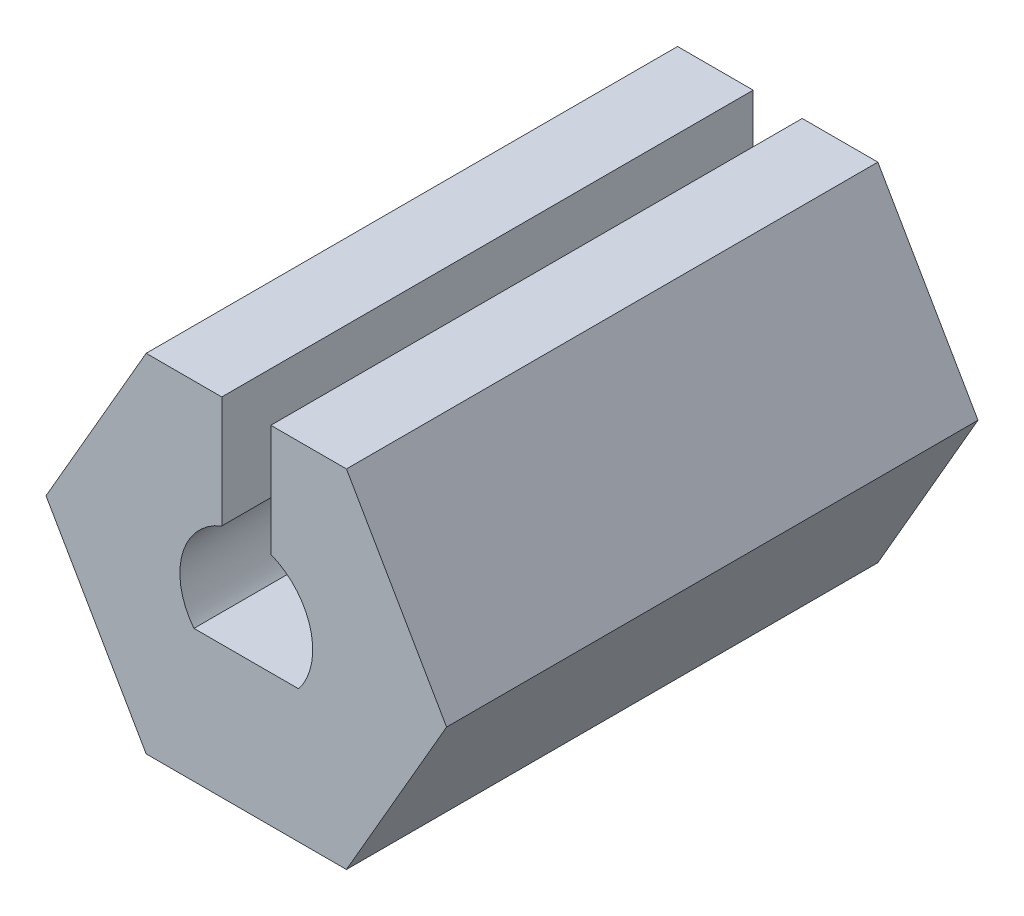
ISO-10303-21;
HEADER;
FILE_DESCRIPTION(('STEP AP214'),'2;1');
FILE_NAME('part.step','',(''),(''),'','','');
FILE_SCHEMA(('AUTOMOTIVE_DESIGN { 1 0 10303 214 1 1 1 1 }'));
ENDSEC;
DATA;
#1=APPLICATION_CONTEXT('core data for automotive mechanical design processes');
#2=APPLICATION_PROTOCOL_DEFINITION('international standard','automotive_design',2000,#1);
#3=PRODUCT_CONTEXT('',#1,'mechanical');
#4=PRODUCT('Part','Part','',(#3));
#5=PRODUCT_RELATED_PRODUCT_CATEGORY('part','',(#4));
#6=PRODUCT_DEFINITION_FORMATION('','',#4);
#7=PRODUCT_DEFINITION_CONTEXT('part definition',#1,'design');
#8=PRODUCT_DEFINITION('design','',#6,#7);
#9=PRODUCT_DEFINITION_SHAPE('','',#8);
#10=(LENGTH_UNIT() NAMED_UNIT(*) SI_UNIT(.MILLI.,.METRE.));
#11=(NAMED_UNIT(*) PLANE_ANGLE_UNIT() SI_UNIT($,.RADIAN.));
#12=(NAMED_UNIT(*) SI_UNIT($,.STERADIAN.) SOLID_ANGLE_UNIT());
#13=UNCERTAINTY_MEASURE_WITH_UNIT(LENGTH_MEASURE(1.E-05),#10,'distance_accuracy_value','');
#14=(GEOMETRIC_REPRESENTATION_CONTEXT(3) GLOBAL_UNCERTAINTY_ASSIGNED_CONTEXT((#13)) GLOBAL_UNIT_ASSIGNED_CONTEXT((#10,
#11,#12)) REPRESENTATION_CONTEXT('',''));
#15=CARTESIAN_POINT('',(0.,0.,0.));
#16=DIRECTION('',(0.,0.,1.));
#17=DIRECTION('',(1.,0.,0.));
#18=AXIS2_PLACEMENT_3D('',#15,#16,#17);
#19=CARTESIAN_POINT('',(0.,0.,13.));
#20=DIRECTION('',(0.,0.,-1.));
#21=DIRECTION('',(-1.,0.,0.));
#22=AXIS2_PLACEMENT_3D('',#19,#20,#21);
#23=CYLINDRICAL_SURFACE('',#22,1.625);
#24=CARTESIAN_POINT('',(0.,0.,0.));
#25=DIRECTION('',(0.,0.,1.));
#26=DIRECTION('',(1.,0.,0.));
#27=AXIS2_PLACEMENT_3D('',#24,#25,#26);
#28=CIRCLE('',#27,1.625);
#29=CARTESIAN_POINT('',(-0.6,1.5101738310539,0.));
#30=VERTEX_POINT('',#29);
#31=CARTESIAN_POINT('',(-1.28086884574495,-1.,0.));
#32=VERTEX_POINT('',#31);
#33=EDGE_CURVE('E162',#30,#32,#28,.T.);
#34=ORIENTED_EDGE('',*,*,#33,.F.);
#35=DIRECTION('',(0.,0.,-1.));
#36=VECTOR('',#35,1.);
#37=CARTESIAN_POINT('',(-0.6,1.5101738310539,13.));
#38=LINE('',#37,#36);
#39=CARTESIAN_POINT('',(-0.6,1.5101738310539,13.));
#40=VERTEX_POINT('',#39);
#41=EDGE_CURVE('E11',#40,#30,#38,.T.);
#42=ORIENTED_EDGE('',*,*,#41,.F.);
#43=CARTESIAN_POINT('',(0.,0.,13.));
#44=DIRECTION('',(0.,0.,1.));
#45=DIRECTION('',(1.,0.,0.));
#46=AXIS2_PLACEMENT_3D('',#43,#44,#45);
#47=CIRCLE('',#46,1.625);
#48=CARTESIAN_POINT('',(-1.28086884574495,-1.,13.));
#49=VERTEX_POINT('',#48);
#50=EDGE_CURVE('E150',#40,#49,#47,.T.);
#51=ORIENTED_EDGE('',*,*,#50,.T.);
#52=DIRECTION('',(0.,0.,-1.));
#53=VECTOR('',#52,1.);
#54=CARTESIAN_POINT('',(-1.28086884574495,-1.,13.));
#55=LINE('',#54,#53);
#56=EDGE_CURVE('E52',#49,#32,#55,.T.);
#57=ORIENTED_EDGE('',*,*,#56,.T.);
#58=EDGE_LOOP('',(#34,#42,#51,#57));
#59=FACE_BOUND('',#58,.T.);
#60=ADVANCED_FACE('F35',(#59),#23,.F.);
#61=CARTESIAN_POINT('',(-0.599999999999999,0.,13.));
#62=DIRECTION('',(1.,0.,0.));
#63=DIRECTION('',(0.,1.,0.));
#64=AXIS2_PLACEMENT_3D('',#61,#62,#63);
#65=PLANE('',#64);
#66=DIRECTION('',(0.,-1.,0.));
#67=VECTOR('',#66,1.);
#68=CARTESIAN_POINT('',(-0.599999999999999,0.,0.));
#69=LINE('',#68,#67);
#70=CARTESIAN_POINT('',(-0.6,4.24352447854375,0.));
#71=VERTEX_POINT('',#70);
#72=EDGE_CURVE('E198',#71,#30,#69,.T.);
#73=ORIENTED_EDGE('',*,*,#72,.F.);
#74=DIRECTION('',(0.,0.,-1.));
#75=VECTOR('',#74,1.);
#76=CARTESIAN_POINT('',(-0.6,4.24352447854375,13.));
#77=LINE('',#76,#75);
#78=CARTESIAN_POINT('',(-0.6,4.24352447854375,13.));
#79=VERTEX_POINT('',#78);
#80=EDGE_CURVE('E44',#79,#71,#77,.T.);
#81=ORIENTED_EDGE('',*,*,#80,.F.);
#82=DIRECTION('',(0.,-1.,0.));
#83=VECTOR('',#82,1.);
#84=CARTESIAN_POINT('',(-0.599999999999999,0.,13.));
#85=LINE('',#84,#83);
#86=EDGE_CURVE('E153',#79,#40,#85,.T.);
#87=ORIENTED_EDGE('',*,*,#86,.T.);
#88=ORIENTED_EDGE('',*,*,#41,.T.);
#89=EDGE_LOOP('',(#73,#81,#87,#88));
#90=FACE_BOUND('',#89,.T.);
#91=ADVANCED_FACE('F37',(#90),#65,.T.);
#92=CARTESIAN_POINT('',(0.,4.24352447854375,13.));
#93=DIRECTION('',(0.,-1.,0.));
#94=DIRECTION('',(0.,0.,-1.));
#95=AXIS2_PLACEMENT_3D('',#92,#93,#94);
#96=PLANE('',#95);
#97=DIRECTION('',(-1.,0.,0.));
#98=VECTOR('',#97,1.);
#99=CARTESIAN_POINT('',(0.,4.24352447854375,0.));
#100=LINE('',#99,#98);
#101=CARTESIAN_POINT('',(-2.45,4.24352447854375,0.));
#102=VERTEX_POINT('',#101);
#103=EDGE_CURVE('E191',#71,#102,#100,.T.);
#104=ORIENTED_EDGE('',*,*,#103,.T.);
#105=DIRECTION('',(0.,0.,-1.));
#106=VECTOR('',#105,1.);
#107=CARTESIAN_POINT('',(-2.45,4.24352447854375,13.));
#108=LINE('',#107,#106);
#109=CARTESIAN_POINT('',(-2.45,4.24352447854375,13.));
#110=VERTEX_POINT('',#109);
#111=EDGE_CURVE('E184',#110,#102,#108,.T.);
#112=ORIENTED_EDGE('',*,*,#111,.F.);
#113=DIRECTION('',(-1.,0.,0.));
#114=VECTOR('',#113,1.);
#115=CARTESIAN_POINT('',(0.,4.24352447854375,13.));
#116=LINE('',#115,#114);
#117=EDGE_CURVE('E156',#79,#110,#116,.T.);
#118=ORIENTED_EDGE('',*,*,#117,.F.);
#119=ORIENTED_EDGE('',*,*,#80,.T.);
#120=EDGE_LOOP('',(#104,#112,#118,#119));
#121=FACE_BOUND('',#120,.T.);
#122=ADVANCED_FACE('F189',(#121),#96,.F.);
#123=CARTESIAN_POINT('',(-3.675,2.12176223927187,13.));
#124=DIRECTION('',(0.866025403784439,-0.5,0.));
#125=DIRECTION('',(0.5,0.866025403784439,0.));
#126=AXIS2_PLACEMENT_3D('',#123,#124,#125);
#127=PLANE('',#126);
#128=DIRECTION('',(-0.5,-0.866025403784439,0.));
#129=VECTOR('',#128,1.);
#130=CARTESIAN_POINT('',(-3.675,2.12176223927187,0.));
#131=LINE('',#130,#129);
#132=CARTESIAN_POINT('',(-4.9,0.,0.));
#133=VERTEX_POINT('',#132);
#134=EDGE_CURVE('E200',#102,#133,#131,.T.);
#135=ORIENTED_EDGE('',*,*,#134,.T.);
#136=DIRECTION('',(0.,0.,-1.));
#137=VECTOR('',#136,1.);
#138=CARTESIAN_POINT('',(-4.9,0.,13.));
#139=LINE('',#138,#137);
#140=CARTESIAN_POINT('',(-4.9,0.,13.));
#141=VERTEX_POINT('',#140);
#142=EDGE_CURVE('E181',#141,#133,#139,.T.);
#143=ORIENTED_EDGE('',*,*,#142,.F.);
#144=DIRECTION('',(-0.5,-0.866025403784439,0.));
#145=VECTOR('',#144,1.);
#146=CARTESIAN_POINT('',(-3.675,2.12176223927187,13.));
#147=LINE('',#146,#145);
#148=EDGE_CURVE('E237',#110,#141,#147,.T.);
#149=ORIENTED_EDGE('',*,*,#148,.F.);
#150=ORIENTED_EDGE('',*,*,#111,.T.);
#151=EDGE_LOOP('',(#135,#143,#149,#150));
#152=FACE_BOUND('',#151,.T.);
#153=ADVANCED_FACE('F241',(#152),#127,.F.);
#154=CARTESIAN_POINT('',(-3.675,-2.12176223927187,13.));
#155=DIRECTION('',(0.866025403784439,0.5,0.));
#156=DIRECTION('',(-0.5,0.866025403784439,0.));
#157=AXIS2_PLACEMENT_3D('',#154,#155,#156);
#158=PLANE('',#157);
#159=DIRECTION('',(0.5,-0.866025403784439,0.));
#160=VECTOR('',#159,1.);
#161=CARTESIAN_POINT('',(-3.675,-2.12176223927187,0.));
#162=LINE('',#161,#160);
#163=CARTESIAN_POINT('',(-2.45,-4.24352447854375,0.));
#164=VERTEX_POINT('',#163);
#165=EDGE_CURVE('E206',#133,#164,#162,.T.);
#166=ORIENTED_EDGE('',*,*,#165,.T.);
#167=DIRECTION('',(0.,0.,-1.));
#168=VECTOR('',#167,1.);
#169=CARTESIAN_POINT('',(-2.45,-4.24352447854375,13.));
#170=LINE('',#169,#168);
#171=CARTESIAN_POINT('',(-2.45,-4.24352447854375,13.));
#172=VERTEX_POINT('',#171);
#173=EDGE_CURVE('E178',#172,#164,#170,.T.);
#174=ORIENTED_EDGE('',*,*,#173,.F.);
#175=DIRECTION('',(0.5,-0.866025403784439,0.));
#176=VECTOR('',#175,1.);
#177=CARTESIAN_POINT('',(-3.675,-2.12176223927187,13.));
#178=LINE('',#177,#176);
#179=EDGE_CURVE('E235',#141,#172,#178,.T.);
#180=ORIENTED_EDGE('',*,*,#179,.F.);
#181=ORIENTED_EDGE('',*,*,#142,.T.);
#182=EDGE_LOOP('',(#166,#174,#180,#181));
#183=FACE_BOUND('',#182,.T.);
#184=ADVANCED_FACE('F245',(#183),#158,.F.);
#185=CARTESIAN_POINT('',(0.,-4.24352447854375,13.));
#186=DIRECTION('',(0.,1.,0.));
#187=DIRECTION('',(-1.,0.,0.));
#188=AXIS2_PLACEMENT_3D('',#185,#186,#187);
#189=PLANE('',#188);
#190=DIRECTION('',(1.,0.,0.));
#191=VECTOR('',#190,1.);
#192=CARTESIAN_POINT('',(0.,-4.24352447854375,0.));
#193=LINE('',#192,#191);
#194=CARTESIAN_POINT('',(2.45,-4.24352447854375,0.));
#195=VERTEX_POINT('',#194);
#196=EDGE_CURVE('E208',#164,#195,#193,.T.);
#197=ORIENTED_EDGE('',*,*,#196,.T.);
#198=DIRECTION('',(0.,0.,-1.));
#199=VECTOR('',#198,1.);
#200=CARTESIAN_POINT('',(2.45,-4.24352447854375,13.));
#201=LINE('',#200,#199);
#202=CARTESIAN_POINT('',(2.45,-4.24352447854375,13.));
#203=VERTEX_POINT('',#202);
#204=EDGE_CURVE('E175',#203,#195,#201,.T.);
#205=ORIENTED_EDGE('',*,*,#204,.F.);
#206=DIRECTION('',(1.,0.,0.));
#207=VECTOR('',#206,1.);
#208=CARTESIAN_POINT('',(0.,-4.24352447854375,13.));
#209=LINE('',#208,#207);
#210=EDGE_CURVE('E231',#172,#203,#209,.T.);
#211=ORIENTED_EDGE('',*,*,#210,.F.);
#212=ORIENTED_EDGE('',*,*,#173,.T.);
#213=EDGE_LOOP('',(#197,#205,#211,#212));
#214=FACE_BOUND('',#213,.T.);
#215=ADVANCED_FACE('F248',(#214),#189,.F.);
#216=CARTESIAN_POINT('',(3.675,-2.12176223927187,13.));
#217=DIRECTION('',(-0.866025403784439,0.5,0.));
#218=DIRECTION('',(-0.5,-0.866025403784439,0.));
#219=AXIS2_PLACEMENT_3D('',#216,#217,#218);
#220=PLANE('',#219);
#221=DIRECTION('',(0.5,0.866025403784439,0.));
#222=VECTOR('',#221,1.);
#223=CARTESIAN_POINT('',(3.675,-2.12176223927187,0.));
#224=LINE('',#223,#222);
#225=CARTESIAN_POINT('',(4.9,0.,0.));
#226=VERTEX_POINT('',#225);
#227=EDGE_CURVE('E210',#195,#226,#224,.T.);
#228=ORIENTED_EDGE('',*,*,#227,.T.);
#229=DIRECTION('',(0.,0.,-1.));
#230=VECTOR('',#229,1.);
#231=CARTESIAN_POINT('',(4.9,0.,13.));
#232=LINE('',#231,#230);
#233=CARTESIAN_POINT('',(4.9,0.,13.));
#234=VERTEX_POINT('',#233);
#235=EDGE_CURVE('E172',#234,#226,#232,.T.);
#236=ORIENTED_EDGE('',*,*,#235,.F.);
#237=DIRECTION('',(0.5,0.866025403784439,0.));
#238=VECTOR('',#237,1.);
#239=CARTESIAN_POINT('',(3.675,-2.12176223927187,13.));
#240=LINE('',#239,#238);
#241=EDGE_CURVE('E228',#203,#234,#240,.T.);
#242=ORIENTED_EDGE('',*,*,#241,.F.);
#243=ORIENTED_EDGE('',*,*,#204,.T.);
#244=EDGE_LOOP('',(#228,#236,#242,#243));
#245=FACE_BOUND('',#244,.T.);
#246=ADVANCED_FACE('F222',(#245),#220,.F.);
#247=CARTESIAN_POINT('',(3.675,2.12176223927188,13.));
#248=DIRECTION('',(-0.866025403784438,-0.5,0.));
#249=DIRECTION('',(0.5,-0.866025403784439,0.));
#250=AXIS2_PLACEMENT_3D('',#247,#248,#249);
#251=PLANE('',#250);
#252=DIRECTION('',(-0.5,0.866025403784439,0.));
#253=VECTOR('',#252,1.);
#254=CARTESIAN_POINT('',(3.675,2.12176223927188,0.));
#255=LINE('',#254,#253);
#256=CARTESIAN_POINT('',(2.45,4.24352447854375,0.));
#257=VERTEX_POINT('',#256);
#258=EDGE_CURVE('E211',#226,#257,#255,.T.);
#259=ORIENTED_EDGE('',*,*,#258,.T.);
#260=DIRECTION('',(0.,0.,-1.));
#261=VECTOR('',#260,1.);
#262=CARTESIAN_POINT('',(2.45,4.24352447854375,13.));
#263=LINE('',#262,#261);
#264=CARTESIAN_POINT('',(2.45,4.24352447854375,13.));
#265=VERTEX_POINT('',#264);
#266=EDGE_CURVE('E169',#265,#257,#263,.T.);
#267=ORIENTED_EDGE('',*,*,#266,.F.);
#268=DIRECTION('',(-0.5,0.866025403784439,0.));
#269=VECTOR('',#268,1.);
#270=CARTESIAN_POINT('',(3.675,2.12176223927188,13.));
#271=LINE('',#270,#269);
#272=EDGE_CURVE('E227',#234,#265,#271,.T.);
#273=ORIENTED_EDGE('',*,*,#272,.F.);
#274=ORIENTED_EDGE('',*,*,#235,.T.);
#275=EDGE_LOOP('',(#259,#267,#273,#274));
#276=FACE_BOUND('',#275,.T.);
#277=ADVANCED_FACE('F226',(#276),#251,.F.);
#278=CARTESIAN_POINT('',(0.6,4.24352447854375,0.));
#279=VERTEX_POINT('',#278);
#280=EDGE_CURVE('E202',#257,#279,#100,.T.);
#281=ORIENTED_EDGE('',*,*,#280,.T.);
#282=DIRECTION('',(0.,0.,-1.));
#283=VECTOR('',#282,1.);
#284=CARTESIAN_POINT('',(0.6,4.24352447854375,13.));
#285=LINE('',#284,#283);
#286=CARTESIAN_POINT('',(0.6,4.24352447854375,13.));
#287=VERTEX_POINT('',#286);
#288=EDGE_CURVE('E145',#287,#279,#285,.T.);
#289=ORIENTED_EDGE('',*,*,#288,.F.);
#290=EDGE_CURVE('E133',#265,#287,#116,.T.);
#291=ORIENTED_EDGE('',*,*,#290,.F.);
#292=ORIENTED_EDGE('',*,*,#266,.T.);
#293=EDGE_LOOP('',(#281,#289,#291,#292));
#294=FACE_BOUND('',#293,.T.);
#295=ADVANCED_FACE('F217',(#294),#96,.F.);
#296=CARTESIAN_POINT('',(0.600000000000001,0.,13.));
#297=DIRECTION('',(1.,0.,0.));
#298=DIRECTION('',(0.,1.,0.));
#299=AXIS2_PLACEMENT_3D('',#296,#297,#298);
#300=PLANE('',#299);
#301=DIRECTION('',(0.,-1.,0.));
#302=VECTOR('',#301,1.);
#303=CARTESIAN_POINT('',(0.600000000000001,0.,0.));
#304=LINE('',#303,#302);
#305=CARTESIAN_POINT('',(0.6,1.5101738310539,0.));
#306=VERTEX_POINT('',#305);
#307=EDGE_CURVE('E142',#279,#306,#304,.T.);
#308=ORIENTED_EDGE('',*,*,#307,.T.);
#309=DIRECTION('',(0.,0.,-1.));
#310=VECTOR('',#309,1.);
#311=CARTESIAN_POINT('',(0.6,1.5101738310539,13.));
#312=LINE('',#311,#310);
#313=CARTESIAN_POINT('',(0.6,1.5101738310539,13.));
#314=VERTEX_POINT('',#313);
#315=EDGE_CURVE('E139',#314,#306,#312,.T.);
#316=ORIENTED_EDGE('',*,*,#315,.F.);
#317=DIRECTION('',(0.,-1.,0.));
#318=VECTOR('',#317,1.);
#319=CARTESIAN_POINT('',(0.600000000000001,0.,13.));
#320=LINE('',#319,#318);
#321=EDGE_CURVE('E126',#287,#314,#320,.T.);
#322=ORIENTED_EDGE('',*,*,#321,.F.);
#323=ORIENTED_EDGE('',*,*,#288,.T.);
#324=EDGE_LOOP('',(#308,#316,#322,#323));
#325=FACE_BOUND('',#324,.T.);
#326=ADVANCED_FACE('F140',(#325),#300,.F.);
#327=CARTESIAN_POINT('',(1.28086884574495,-1.,0.));
#328=VERTEX_POINT('',#327);
#329=EDGE_CURVE('E158',#328,#306,#28,.T.);
#330=ORIENTED_EDGE('',*,*,#329,.F.);
#331=DIRECTION('',(0.,0.,-1.));
#332=VECTOR('',#331,1.);
#333=CARTESIAN_POINT('',(1.28086884574495,-1.,13.));
#334=LINE('',#333,#332);
#335=CARTESIAN_POINT('',(1.28086884574495,-1.,13.));
#336=VERTEX_POINT('',#335);
#337=EDGE_CURVE('E89',#336,#328,#334,.T.);
#338=ORIENTED_EDGE('',*,*,#337,.F.);
#339=EDGE_CURVE('E131',#336,#314,#47,.T.);
#340=ORIENTED_EDGE('',*,*,#339,.T.);
#341=ORIENTED_EDGE('',*,*,#315,.T.);
#342=EDGE_LOOP('',(#330,#338,#340,#341));
#343=FACE_BOUND('',#342,.T.);
#344=ADVANCED_FACE('F147',(#343),#23,.F.);
#345=CARTESIAN_POINT('',(0.,-1.,13.));
#346=DIRECTION('',(0.,1.,0.));
#347=DIRECTION('',(0.,0.,1.));
#348=AXIS2_PLACEMENT_3D('',#345,#346,#347);
#349=PLANE('',#348);
#350=DIRECTION('',(1.,0.,0.));
#351=VECTOR('',#350,1.);
#352=CARTESIAN_POINT('',(0.,-1.,0.));
#353=LINE('',#352,#351);
#354=EDGE_CURVE('E154',#32,#328,#353,.T.);
#355=ORIENTED_EDGE('',*,*,#354,.F.);
#356=ORIENTED_EDGE('',*,*,#56,.F.);
#357=DIRECTION('',(1.,0.,0.));
#358=VECTOR('',#357,1.);
#359=CARTESIAN_POINT('',(0.,-1.,13.));
#360=LINE('',#359,#358);
#361=EDGE_CURVE('E148',#49,#336,#360,.T.);
#362=ORIENTED_EDGE('',*,*,#361,.T.);
#363=ORIENTED_EDGE('',*,*,#337,.T.);
#364=EDGE_LOOP('',(#355,#356,#362,#363));
#365=FACE_BOUND('',#364,.T.);
#366=ADVANCED_FACE('F265',(#365),#349,.T.);
#367=CARTESIAN_POINT('',(0.,0.,13.));
#368=DIRECTION('',(0.,0.,1.));
#369=DIRECTION('',(1.,0.,0.));
#370=AXIS2_PLACEMENT_3D('',#367,#368,#369);
#371=PLANE('',#370);
#372=ORIENTED_EDGE('',*,*,#50,.F.);
#373=ORIENTED_EDGE('',*,*,#86,.F.);
#374=ORIENTED_EDGE('',*,*,#117,.T.);
#375=ORIENTED_EDGE('',*,*,#148,.T.);
#376=ORIENTED_EDGE('',*,*,#179,.T.);
#377=ORIENTED_EDGE('',*,*,#210,.T.);
#378=ORIENTED_EDGE('',*,*,#241,.T.);
#379=ORIENTED_EDGE('',*,*,#272,.T.);
#380=ORIENTED_EDGE('',*,*,#290,.T.);
#381=ORIENTED_EDGE('',*,*,#321,.T.);
#382=ORIENTED_EDGE('',*,*,#339,.F.);
#383=ORIENTED_EDGE('',*,*,#361,.F.);
#384=EDGE_LOOP('',(#372,#373,#374,#375,#376,#377,#378,#379,#380,#381,#382,#383));
#385=FACE_BOUND('',#384,.T.);
#386=ADVANCED_FACE('F128',(#385),#371,.T.);
#387=CARTESIAN_POINT('',(0.,0.,0.));
#388=DIRECTION('',(0.,0.,1.));
#389=DIRECTION('',(1.,0.,0.));
#390=AXIS2_PLACEMENT_3D('',#387,#388,#389);
#391=PLANE('',#390);
#392=ORIENTED_EDGE('',*,*,#33,.T.);
#393=ORIENTED_EDGE('',*,*,#354,.T.);
#394=ORIENTED_EDGE('',*,*,#329,.T.);
#395=ORIENTED_EDGE('',*,*,#307,.F.);
#396=ORIENTED_EDGE('',*,*,#280,.F.);
#397=ORIENTED_EDGE('',*,*,#258,.F.);
#398=ORIENTED_EDGE('',*,*,#227,.F.);
#399=ORIENTED_EDGE('',*,*,#196,.F.);
#400=ORIENTED_EDGE('',*,*,#165,.F.);
#401=ORIENTED_EDGE('',*,*,#134,.F.);
#402=ORIENTED_EDGE('',*,*,#103,.F.);
#403=ORIENTED_EDGE('',*,*,#72,.T.);
#404=EDGE_LOOP('',(#392,#393,#394,#395,#396,#397,#398,#399,#400,#401,#402,#403));
#405=FACE_BOUND('',#404,.T.);
#406=ADVANCED_FACE('F197',(#405),#391,.F.);
#407=CLOSED_SHELL('',(#60,#91,#122,#153,#184,#215,#246,#277,#295,#326,#344,#366,#386,#406));
#408=MANIFOLD_SOLID_BREP('B2',#407);
#409=ADVANCED_BREP_SHAPE_REPRESENTATION('',(#18,#408),#14);
#410=SHAPE_DEFINITION_REPRESENTATION(#9,#409);
ENDSEC;
END-ISO-10303-21;
